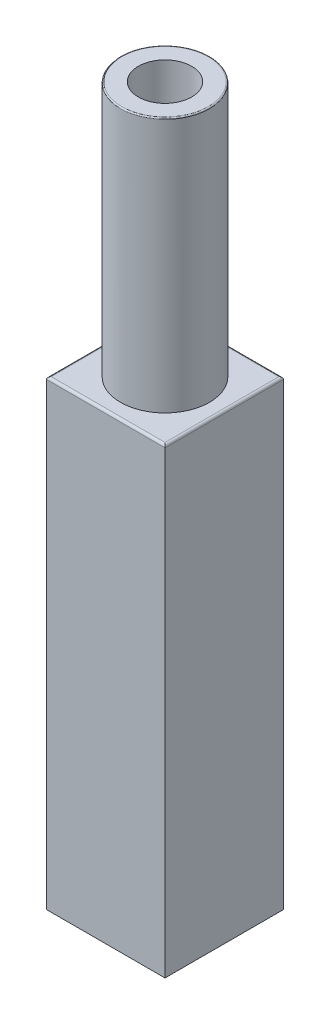
ISO-10303-21;
HEADER;
FILE_DESCRIPTION(('STEP AP214'),'2;1');
FILE_NAME('part.step','',(''),(''),'','','');
FILE_SCHEMA(('AUTOMOTIVE_DESIGN { 1 0 10303 214 1 1 1 1 }'));
ENDSEC;
DATA;
#1=APPLICATION_CONTEXT('core data for automotive mechanical design processes');
#2=APPLICATION_PROTOCOL_DEFINITION('international standard','automotive_design',2000,#1);
#3=PRODUCT_CONTEXT('',#1,'mechanical');
#4=PRODUCT('Part','Part','',(#3));
#5=PRODUCT_RELATED_PRODUCT_CATEGORY('part','',(#4));
#6=PRODUCT_DEFINITION_FORMATION('','',#4);
#7=PRODUCT_DEFINITION_CONTEXT('part definition',#1,'design');
#8=PRODUCT_DEFINITION('design','',#6,#7);
#9=PRODUCT_DEFINITION_SHAPE('','',#8);
#10=(LENGTH_UNIT() NAMED_UNIT(*) SI_UNIT(.MILLI.,.METRE.));
#11=(NAMED_UNIT(*) PLANE_ANGLE_UNIT() SI_UNIT($,.RADIAN.));
#12=(NAMED_UNIT(*) SI_UNIT($,.STERADIAN.) SOLID_ANGLE_UNIT());
#13=UNCERTAINTY_MEASURE_WITH_UNIT(LENGTH_MEASURE(1.E-05),#10,'distance_accuracy_value','');
#14=(GEOMETRIC_REPRESENTATION_CONTEXT(3) GLOBAL_UNCERTAINTY_ASSIGNED_CONTEXT((#13)) GLOBAL_UNIT_ASSIGNED_CONTEXT((#10,
#11,#12)) REPRESENTATION_CONTEXT('',''));
#15=CARTESIAN_POINT('',(0.,0.,0.));
#16=DIRECTION('',(0.,0.,1.));
#17=DIRECTION('',(1.,0.,0.));
#18=AXIS2_PLACEMENT_3D('',#15,#16,#17);
#19=CARTESIAN_POINT('',(0.,365.528532985271,0.));
#20=DIRECTION('',(0.,1.,0.));
#21=DIRECTION('',(0.,0.,1.));
#22=AXIS2_PLACEMENT_3D('',#19,#20,#21);
#23=PLANE('',#22);
#24=CARTESIAN_POINT('',(0.,365.528532985271,0.));
#25=DIRECTION('',(0.,1.,0.));
#26=DIRECTION('',(0.,0.,1.));
#27=AXIS2_PLACEMENT_3D('',#24,#25,#26);
#28=CIRCLE('',#27,36.5);
#29=CARTESIAN_POINT('',(0.,365.528532985271,36.5));
#30=VERTEX_POINT('',#29);
#31=EDGE_CURVE('E54',#30,#30,#28,.T.);
#32=ORIENTED_EDGE('',*,*,#31,.T.);
#33=EDGE_LOOP('',(#32));
#34=FACE_BOUND('',#33,.T.);
#35=CARTESIAN_POINT('',(0.,365.528532985271,0.));
#36=DIRECTION('',(0.,1.,0.));
#37=DIRECTION('',(0.,0.,1.));
#38=AXIS2_PLACEMENT_3D('',#35,#36,#37);
#39=CIRCLE('',#38,22.5);
#40=CARTESIAN_POINT('',(0.,365.528532985271,-22.5));
#41=VERTEX_POINT('',#40);
#42=EDGE_CURVE('E62',#41,#41,#39,.T.);
#43=ORIENTED_EDGE('',*,*,#42,.F.);
#44=EDGE_LOOP('',(#43));
#45=FACE_BOUND('',#44,.T.);
#46=ADVANCED_FACE('F47',(#34,#45),#23,.T.);
#47=CARTESIAN_POINT('',(0.,0.,0.));
#48=DIRECTION('',(0.,1.,0.));
#49=DIRECTION('',(0.,0.,1.));
#50=AXIS2_PLACEMENT_3D('',#47,#48,#49);
#51=PLANE('',#50);
#52=CARTESIAN_POINT('',(0.,0.,0.));
#53=DIRECTION('',(0.,1.,0.));
#54=DIRECTION('',(0.,0.,1.));
#55=AXIS2_PLACEMENT_3D('',#52,#53,#54);
#56=CIRCLE('',#55,37.5);
#57=CARTESIAN_POINT('',(0.,0.,-37.5));
#58=VERTEX_POINT('',#57);
#59=EDGE_CURVE('E58',#58,#58,#56,.T.);
#60=ORIENTED_EDGE('',*,*,#59,.F.);
#61=EDGE_LOOP('',(#60));
#62=FACE_BOUND('',#61,.T.);
#63=CARTESIAN_POINT('',(0.,0.,0.));
#64=DIRECTION('',(0.,1.,0.));
#65=DIRECTION('',(0.,0.,1.));
#66=AXIS2_PLACEMENT_3D('',#63,#64,#65);
#67=CIRCLE('',#66,22.5);
#68=CARTESIAN_POINT('',(0.,0.,-22.5));
#69=VERTEX_POINT('',#68);
#70=EDGE_CURVE('E65',#69,#69,#67,.T.);
#71=ORIENTED_EDGE('',*,*,#70,.T.);
#72=EDGE_LOOP('',(#71));
#73=FACE_BOUND('',#72,.T.);
#74=ADVANCED_FACE('F75',(#62,#73),#51,.F.);
#75=CARTESIAN_POINT('',(0.,365.528532985271,0.));
#76=DIRECTION('',(0.,-1.,0.));
#77=DIRECTION('',(0.,0.,-1.));
#78=AXIS2_PLACEMENT_3D('',#75,#76,#77);
#79=CYLINDRICAL_SURFACE('',#78,37.5);
#80=CARTESIAN_POINT('',(0.,364.528532985271,0.));
#81=DIRECTION('',(0.,1.,0.));
#82=DIRECTION('',(0.,0.,1.));
#83=AXIS2_PLACEMENT_3D('',#80,#81,#82);
#84=CIRCLE('',#83,37.5);
#85=CARTESIAN_POINT('',(0.,364.528532985271,-37.5));
#86=VERTEX_POINT('',#85);
#87=EDGE_CURVE('E12',#86,#86,#84,.F.);
#88=CARTESIAN_POINT('',(0.,364.528532985271,-37.5));
#89=CARTESIAN_POINT('',(0.,360.731360766674,-37.5));
#90=CARTESIAN_POINT('',(0.,356.934188548078,-37.5));
#91=CARTESIAN_POINT('',(0.,349.339844110885,-37.5));
#92=CARTESIAN_POINT('',(0.,345.542671892288,-37.5));
#93=CARTESIAN_POINT('',(0.,337.948327455095,-37.5));
#94=CARTESIAN_POINT('',(0.,334.151155236498,-37.5));
#95=CARTESIAN_POINT('',(0.,326.556810799305,-37.5));
#96=CARTESIAN_POINT('',(0.,322.759638580708,-37.5));
#97=CARTESIAN_POINT('',(0.,315.165294143515,-37.5));
#98=CARTESIAN_POINT('',(0.,311.368121924919,-37.5));
#99=CARTESIAN_POINT('',(0.,303.773777487726,-37.5));
#100=CARTESIAN_POINT('',(0.,299.976605269129,-37.5));
#101=CARTESIAN_POINT('',(0.,292.382260831936,-37.5));
#102=CARTESIAN_POINT('',(0.,288.585088613339,-37.5));
#103=CARTESIAN_POINT('',(0.,280.990744176146,-37.5));
#104=CARTESIAN_POINT('',(0.,277.19357195755,-37.5));
#105=CARTESIAN_POINT('',(0.,269.599227520357,-37.5));
#106=CARTESIAN_POINT('',(0.,265.80205530176,-37.5));
#107=CARTESIAN_POINT('',(0.,258.207710864567,-37.5));
#108=CARTESIAN_POINT('',(0.,254.41053864597,-37.5));
#109=CARTESIAN_POINT('',(0.,246.816194208777,-37.5));
#110=CARTESIAN_POINT('',(0.,243.019021990181,-37.5));
#111=CARTESIAN_POINT('',(0.,235.424677552987,-37.5));
#112=CARTESIAN_POINT('',(0.,231.627505334391,-37.5));
#113=CARTESIAN_POINT('',(0.,224.033160897198,-37.5));
#114=CARTESIAN_POINT('',(0.,220.235988678601,-37.5));
#115=CARTESIAN_POINT('',(0.,212.641644241408,-37.5));
#116=CARTESIAN_POINT('',(0.,208.844472022811,-37.5));
#117=CARTESIAN_POINT('',(0.,201.250127585618,-37.5));
#118=CARTESIAN_POINT('',(0.,197.452955367022,-37.5));
#119=CARTESIAN_POINT('',(0.,189.858610929829,-37.5));
#120=CARTESIAN_POINT('',(0.,186.061438711232,-37.5));
#121=CARTESIAN_POINT('',(0.,178.467094274039,-37.5));
#122=CARTESIAN_POINT('',(0.,174.669922055442,-37.5));
#123=CARTESIAN_POINT('',(0.,167.075577618249,-37.5));
#124=CARTESIAN_POINT('',(0.,163.278405399653,-37.5));
#125=CARTESIAN_POINT('',(0.,155.684060962459,-37.5));
#126=CARTESIAN_POINT('',(0.,151.886888743863,-37.5));
#127=CARTESIAN_POINT('',(0.,144.29254430667,-37.5));
#128=CARTESIAN_POINT('',(0.,140.495372088073,-37.5));
#129=CARTESIAN_POINT('',(0.,132.90102765088,-37.5));
#130=CARTESIAN_POINT('',(0.,129.103855432283,-37.5));
#131=CARTESIAN_POINT('',(0.,121.50951099509,-37.5));
#132=CARTESIAN_POINT('',(0.,117.712338776494,-37.5));
#133=CARTESIAN_POINT('',(0.,110.117994339301,-37.5));
#134=CARTESIAN_POINT('',(0.,106.320822120704,-37.5));
#135=CARTESIAN_POINT('',(0.,98.7264776835108,-37.5));
#136=CARTESIAN_POINT('',(0.,94.9293054649143,-37.5));
#137=CARTESIAN_POINT('',(0.,87.3349610277212,-37.5));
#138=CARTESIAN_POINT('',(0.,83.5377888091246,-37.5));
#139=CARTESIAN_POINT('',(0.,75.9434443719314,-37.5));
#140=CARTESIAN_POINT('',(0.,72.1462721533348,-37.5));
#141=CARTESIAN_POINT('',(0.,64.5519277161417,-37.5));
#142=CARTESIAN_POINT('',(0.,60.7547554975451,-37.5));
#143=CARTESIAN_POINT('',(0.,53.160411060352,-37.5));
#144=CARTESIAN_POINT('',(0.,49.3632388417554,-37.5));
#145=CARTESIAN_POINT('',(0.,41.7688944045623,-37.5));
#146=CARTESIAN_POINT('',(0.,37.9717221859657,-37.5));
#147=CARTESIAN_POINT('',(0.,30.3773777487725,-37.5));
#148=CARTESIAN_POINT('',(0.,26.580205530176,-37.5));
#149=CARTESIAN_POINT('',(0.,18.9858610929828,-37.5));
#150=CARTESIAN_POINT('',(0.,15.1886888743862,-37.5));
#151=CARTESIAN_POINT('',(0.,7.59434443719309,-37.5));
#152=CARTESIAN_POINT('',(0.,3.79717221859654,-37.5));
#153=CARTESIAN_POINT('',(0.,0.,-37.5));
#154=B_SPLINE_CURVE_WITH_KNOTS('',3,(#88,#89,#90,#91,#92,#93,#94,#95,#96,#97,#98,#99,#100,#101,
#102,#103,#104,#105,#106,#107,#108,#109,#110,#111,#112,#113,#114,#115,#116,#117,#118,#119,#120,
#121,#122,#123,#124,#125,#126,#127,#128,#129,#130,#131,#132,#133,#134,#135,#136,#137,#138,#139,
#140,#141,#142,#143,#144,#145,#146,#147,#148,#149,#150,#151,#152,#153),.UNSPECIFIED.,.F.,.F.,(4,
2,2,2,2,2,2,2,2,2,2,2,2,2,2,2,2,2,2,2,2,2,2,2,2,2,2,2,2,2,2,2,4),(0.,11.3915166557897,
22.7830333115794,34.1745499673692,45.5660666231589,56.9575832789486,68.3490999347383,
79.740616590528,91.1321332463177,102.523649902107,113.915166557897,125.306683213687,
136.698199869477,148.089716525266,159.481233181056,170.872749836846,182.264266492635,
193.655783148425,205.047299804215,216.438816460005,227.830333115794,239.221849771584,
250.613366427374,262.004883083163,273.396399738953,284.787916394743,296.179433050533,
307.570949706322,318.962466362112,330.353983017902,341.745499673691,353.137016329481,
364.528532985271),.UNSPECIFIED.);
#155=EDGE_CURVE('BSEAM80',#86,#58,#154,.T.);
#156=ORIENTED_EDGE('',*,*,#87,.T.);
#157=ORIENTED_EDGE('',*,*,#59,.T.);
#158=ORIENTED_EDGE('',*,*,#155,.T.);
#159=ORIENTED_EDGE('',*,*,#155,.F.);
#160=EDGE_LOOP('',(#156,#158,#157,#159));
#161=FACE_BOUND('',#160,.T.);
#162=ADVANCED_FACE('F80',(#161),#79,.T.);
#163=CARTESIAN_POINT('',(0.,365.528532985271,0.));
#164=DIRECTION('',(0.,-1.,0.));
#165=DIRECTION('',(0.,0.,-1.));
#166=AXIS2_PLACEMENT_3D('',#163,#164,#165);
#167=CYLINDRICAL_SURFACE('',#166,22.5);
#168=CARTESIAN_POINT('',(0.,365.528532985271,-22.5));
#169=CARTESIAN_POINT('',(0.,361.720944100008,-22.5));
#170=CARTESIAN_POINT('',(0.,357.913355214744,-22.5));
#171=CARTESIAN_POINT('',(0.,350.298177444218,-22.5));
#172=CARTESIAN_POINT('',(0.,346.490588558955,-22.5));
#173=CARTESIAN_POINT('',(0.,338.875410788428,-22.5));
#174=CARTESIAN_POINT('',(0.,335.067821903165,-22.5));
#175=CARTESIAN_POINT('',(0.,327.452644132638,-22.5));
#176=CARTESIAN_POINT('',(0.,323.645055247375,-22.5));
#177=CARTESIAN_POINT('',(0.,316.029877476849,-22.5));
#178=CARTESIAN_POINT('',(0.,312.222288591585,-22.5));
#179=CARTESIAN_POINT('',(0.,304.607110821059,-22.5));
#180=CARTESIAN_POINT('',(0.,300.799521935796,-22.5));
#181=CARTESIAN_POINT('',(0.,293.184344165269,-22.5));
#182=CARTESIAN_POINT('',(0.,289.376755280006,-22.5));
#183=CARTESIAN_POINT('',(0.,281.76157750948,-22.5));
#184=CARTESIAN_POINT('',(0.,277.953988624216,-22.5));
#185=CARTESIAN_POINT('',(0.,270.33881085369,-22.5));
#186=CARTESIAN_POINT('',(0.,266.531221968427,-22.5));
#187=CARTESIAN_POINT('',(0.,258.9160441979,-22.5));
#188=CARTESIAN_POINT('',(0.,255.108455312637,-22.5));
#189=CARTESIAN_POINT('',(0.,247.49327754211,-22.5));
#190=CARTESIAN_POINT('',(0.,243.685688656847,-22.5));
#191=CARTESIAN_POINT('',(0.,236.070510886321,-22.5));
#192=CARTESIAN_POINT('',(0.,232.262922001057,-22.5));
#193=CARTESIAN_POINT('',(0.,224.647744230531,-22.5));
#194=CARTESIAN_POINT('',(0.,220.840155345268,-22.5));
#195=CARTESIAN_POINT('',(0.,213.224977574741,-22.5));
#196=CARTESIAN_POINT('',(0.,209.417388689478,-22.5));
#197=CARTESIAN_POINT('',(0.,201.802210918952,-22.5));
#198=CARTESIAN_POINT('',(0.,197.994622033688,-22.5));
#199=CARTESIAN_POINT('',(0.,190.379444263162,-22.5));
#200=CARTESIAN_POINT('',(0.,186.571855377899,-22.5));
#201=CARTESIAN_POINT('',(0.,178.956677607372,-22.5));
#202=CARTESIAN_POINT('',(0.,175.149088722109,-22.5));
#203=CARTESIAN_POINT('',(0.,167.533910951582,-22.5));
#204=CARTESIAN_POINT('',(0.,163.726322066319,-22.5));
#205=CARTESIAN_POINT('',(0.,156.111144295793,-22.5));
#206=CARTESIAN_POINT('',(0.,152.303555410529,-22.5));
#207=CARTESIAN_POINT('',(0.,144.688377640003,-22.5));
#208=CARTESIAN_POINT('',(0.,140.88078875474,-22.5));
#209=CARTESIAN_POINT('',(0.,133.265610984213,-22.5));
#210=CARTESIAN_POINT('',(0.,129.45802209895,-22.5));
#211=CARTESIAN_POINT('',(0.,121.842844328424,-22.5));
#212=CARTESIAN_POINT('',(0.,118.03525544316,-22.5));
#213=CARTESIAN_POINT('',(0.,110.420077672634,-22.5));
#214=CARTESIAN_POINT('',(0.,106.612488787371,-22.5));
#215=CARTESIAN_POINT('',(0.,98.9973110168442,-22.5));
#216=CARTESIAN_POINT('',(0.,95.189722131581,-22.5));
#217=CARTESIAN_POINT('',(0.,87.5745443610545,-22.5));
#218=CARTESIAN_POINT('',(0.,83.7669554757912,-22.5));
#219=CARTESIAN_POINT('',(0.,76.1517777052647,-22.5));
#220=CARTESIAN_POINT('',(0.,72.3441888200015,-22.5));
#221=CARTESIAN_POINT('',(0.,64.729011049475,-22.5));
#222=CARTESIAN_POINT('',(0.,60.9214221642118,-22.5));
#223=CARTESIAN_POINT('',(0.,53.3062443936853,-22.5));
#224=CARTESIAN_POINT('',(0.,49.4986555084221,-22.5));
#225=CARTESIAN_POINT('',(0.,41.8834777378956,-22.5));
#226=CARTESIAN_POINT('',(0.,38.0758888526324,-22.5));
#227=CARTESIAN_POINT('',(0.,30.4607110821059,-22.5));
#228=CARTESIAN_POINT('',(0.,26.6531221968427,-22.5));
#229=CARTESIAN_POINT('',(0.,19.0379444263162,-22.5));
#230=CARTESIAN_POINT('',(0.,15.230355541053,-22.5));
#231=CARTESIAN_POINT('',(0.,7.61517777052649,-22.5));
#232=CARTESIAN_POINT('',(0.,3.80758888526324,-22.5));
#233=CARTESIAN_POINT('',(0.,0.,-22.5));
#234=B_SPLINE_CURVE_WITH_KNOTS('',3,(#168,#169,#170,#171,#172,#173,#174,#175,#176,#177,#178,
#179,#180,#181,#182,#183,#184,#185,#186,#187,#188,#189,#190,#191,#192,#193,#194,#195,#196,#197,
#198,#199,#200,#201,#202,#203,#204,#205,#206,#207,#208,#209,#210,#211,#212,#213,#214,#215,#216,
#217,#218,#219,#220,#221,#222,#223,#224,#225,#226,#227,#228,#229,#230,#231,#232,#233),
.UNSPECIFIED.,.F.,.F.,(4,2,2,2,2,2,2,2,2,2,2,2,2,2,2,2,2,2,2,2,2,2,2,2,2,2,2,2,2,2,2,2,4),(0.,
11.4227666557897,22.8455333115795,34.2682999673692,45.6910666231589,57.1138332789486,
68.5365999347383,79.959366590528,91.3821332463177,102.804899902107,114.227666557897,
125.650433213687,137.073199869477,148.495966525266,159.918733181056,171.341499836846,
182.764266492635,194.187033148425,205.609799804215,217.032566460005,228.455333115794,
239.878099771584,251.300866427374,262.723633083163,274.146399738953,285.569166394743,
296.991933050533,308.414699706322,319.837466362112,331.260233017902,342.682999673691,
354.105766329481,365.528532985271),.UNSPECIFIED.);
#235=EDGE_CURVE('BSEAM71',#41,#69,#234,.T.);
#236=ORIENTED_EDGE('',*,*,#42,.T.);
#237=ORIENTED_EDGE('',*,*,#70,.F.);
#238=ORIENTED_EDGE('',*,*,#235,.T.);
#239=ORIENTED_EDGE('',*,*,#235,.F.);
#240=EDGE_LOOP('',(#236,#238,#237,#239));
#241=FACE_BOUND('',#240,.T.);
#242=ADVANCED_FACE('F71',(#241),#167,.F.);
#243=CARTESIAN_POINT('',(0.,364.528532985271,0.));
#244=DIRECTION('',(0.,1.,0.));
#245=DIRECTION('',(0.,0.,1.));
#246=AXIS2_PLACEMENT_3D('',#243,#244,#245);
#247=TOROIDAL_SURFACE('',#246,36.5,1.);
#248=ORIENTED_EDGE('',*,*,#87,.F.);
#249=EDGE_LOOP('',(#248));
#250=FACE_BOUND('',#249,.T.);
#251=ORIENTED_EDGE('',*,*,#31,.F.);
#252=EDGE_LOOP('',(#251));
#253=FACE_BOUND('',#252,.T.);
#254=ADVANCED_FACE('F49',(#250,#253),#247,.T.);
#255=CLOSED_SHELL('',(#46,#74,#162,#242,#254));
#256=MANIFOLD_SOLID_BREP('B2',#255);
#257=CARTESIAN_POINT('',(-50.,-239.246198725206,50.));
#258=DIRECTION('',(0.,0.,1.));
#259=DIRECTION('',(1.,0.,0.));
#260=AXIS2_PLACEMENT_3D('',#257,#258,#259);
#261=PLANE('',#260);
#262=DIRECTION('',(0.,1.,0.));
#263=VECTOR('',#262,1.);
#264=CARTESIAN_POINT('',(50.,-239.246198725206,50.));
#265=LINE('',#264,#263);
#266=CARTESIAN_POINT('',(50.,-239.246198725206,50.));
#267=VERTEX_POINT('',#266);
#268=CARTESIAN_POINT('',(50.,148.,50.));
#269=VERTEX_POINT('',#268);
#270=EDGE_CURVE('E176',#267,#269,#265,.T.);
#271=ORIENTED_EDGE('',*,*,#270,.T.);
#272=DIRECTION('',(1.,0.,0.));
#273=VECTOR('',#272,1.);
#274=CARTESIAN_POINT('',(-50.,148.,50.));
#275=LINE('',#274,#273);
#276=CARTESIAN_POINT('',(-50.,148.,50.));
#277=VERTEX_POINT('',#276);
#278=EDGE_CURVE('E221',#269,#277,#275,.F.);
#279=ORIENTED_EDGE('',*,*,#278,.T.);
#280=DIRECTION('',(0.,1.,0.));
#281=VECTOR('',#280,1.);
#282=CARTESIAN_POINT('',(-50.,-239.246198725206,50.));
#283=LINE('',#282,#281);
#284=CARTESIAN_POINT('',(-50.,-239.246198725206,50.));
#285=VERTEX_POINT('',#284);
#286=EDGE_CURVE('E194',#285,#277,#283,.T.);
#287=ORIENTED_EDGE('',*,*,#286,.F.);
#288=DIRECTION('',(1.,0.,0.));
#289=VECTOR('',#288,1.);
#290=CARTESIAN_POINT('',(-50.,-239.246198725206,50.));
#291=LINE('',#290,#289);
#292=EDGE_CURVE('E189',#285,#267,#291,.T.);
#293=ORIENTED_EDGE('',*,*,#292,.T.);
#294=EDGE_LOOP('',(#271,#279,#287,#293));
#295=FACE_BOUND('',#294,.T.);
#296=ADVANCED_FACE('F124',(#295),#261,.T.);
#297=CARTESIAN_POINT('',(-50.,-239.246198725206,50.));
#298=DIRECTION('',(1.,0.,0.));
#299=DIRECTION('',(0.,0.,-1.));
#300=AXIS2_PLACEMENT_3D('',#297,#298,#299);
#301=PLANE('',#300);
#302=ORIENTED_EDGE('',*,*,#286,.T.);
#303=DIRECTION('',(0.,0.,-1.));
#304=VECTOR('',#303,1.);
#305=CARTESIAN_POINT('',(-50.,148.,-50.));
#306=LINE('',#305,#304);
#307=CARTESIAN_POINT('',(-50.,148.,-50.));
#308=VERTEX_POINT('',#307);
#309=EDGE_CURVE('E206',#277,#308,#306,.T.);
#310=ORIENTED_EDGE('',*,*,#309,.T.);
#311=DIRECTION('',(0.,1.,0.));
#312=VECTOR('',#311,1.);
#313=CARTESIAN_POINT('',(-50.,-239.246198725206,-50.));
#314=LINE('',#313,#312);
#315=CARTESIAN_POINT('',(-50.,-239.246198725206,-50.));
#316=VERTEX_POINT('',#315);
#317=EDGE_CURVE('E207',#316,#308,#314,.T.);
#318=ORIENTED_EDGE('',*,*,#317,.F.);
#319=DIRECTION('',(0.,0.,-1.));
#320=VECTOR('',#319,1.);
#321=CARTESIAN_POINT('',(-50.,-239.246198725206,50.));
#322=LINE('',#321,#320);
#323=EDGE_CURVE('E184',#285,#316,#322,.T.);
#324=ORIENTED_EDGE('',*,*,#323,.F.);
#325=EDGE_LOOP('',(#302,#310,#318,#324));
#326=FACE_BOUND('',#325,.T.);
#327=ADVANCED_FACE('F255',(#326),#301,.F.);
#328=CARTESIAN_POINT('',(-50.,-239.246198725206,-50.));
#329=DIRECTION('',(0.,0.,1.));
#330=DIRECTION('',(1.,0.,0.));
#331=AXIS2_PLACEMENT_3D('',#328,#329,#330);
#332=PLANE('',#331);
#333=ORIENTED_EDGE('',*,*,#317,.T.);
#334=DIRECTION('',(1.,0.,0.));
#335=VECTOR('',#334,1.);
#336=CARTESIAN_POINT('',(50.,148.,-50.));
#337=LINE('',#336,#335);
#338=CARTESIAN_POINT('',(50.,148.,-50.));
#339=VERTEX_POINT('',#338);
#340=EDGE_CURVE('E45',#308,#339,#337,.T.);
#341=ORIENTED_EDGE('',*,*,#340,.T.);
#342=DIRECTION('',(0.,1.,0.));
#343=VECTOR('',#342,1.);
#344=CARTESIAN_POINT('',(50.,-239.246198725206,-50.));
#345=LINE('',#344,#343);
#346=CARTESIAN_POINT('',(50.,-239.246198725206,-50.));
#347=VERTEX_POINT('',#346);
#348=EDGE_CURVE('E183',#347,#339,#345,.T.);
#349=ORIENTED_EDGE('',*,*,#348,.F.);
#350=DIRECTION('',(1.,0.,0.));
#351=VECTOR('',#350,1.);
#352=CARTESIAN_POINT('',(-50.,-239.246198725206,-50.));
#353=LINE('',#352,#351);
#354=EDGE_CURVE('E191',#316,#347,#353,.T.);
#355=ORIENTED_EDGE('',*,*,#354,.F.);
#356=EDGE_LOOP('',(#333,#341,#349,#355));
#357=FACE_BOUND('',#356,.T.);
#358=ADVANCED_FACE('F260',(#357),#332,.F.);
#359=CARTESIAN_POINT('',(50.,-239.246198725206,50.));
#360=DIRECTION('',(1.,0.,0.));
#361=DIRECTION('',(0.,0.,-1.));
#362=AXIS2_PLACEMENT_3D('',#359,#360,#361);
#363=PLANE('',#362);
#364=ORIENTED_EDGE('',*,*,#348,.T.);
#365=DIRECTION('',(0.,0.,-1.));
#366=VECTOR('',#365,1.);
#367=CARTESIAN_POINT('',(50.,148.,50.));
#368=LINE('',#367,#366);
#369=EDGE_CURVE('E133',#339,#269,#368,.F.);
#370=ORIENTED_EDGE('',*,*,#369,.T.);
#371=ORIENTED_EDGE('',*,*,#270,.F.);
#372=DIRECTION('',(0.,0.,-1.));
#373=VECTOR('',#372,1.);
#374=CARTESIAN_POINT('',(50.,-239.246198725206,50.));
#375=LINE('',#374,#373);
#376=EDGE_CURVE('E179',#267,#347,#375,.T.);
#377=ORIENTED_EDGE('',*,*,#376,.T.);
#378=EDGE_LOOP('',(#364,#370,#371,#377));
#379=FACE_BOUND('',#378,.T.);
#380=ADVANCED_FACE('F178',(#379),#363,.T.);
#381=CARTESIAN_POINT('',(0.,-239.246198725206,0.));
#382=DIRECTION('',(0.,1.,0.));
#383=DIRECTION('',(0.,0.,1.));
#384=AXIS2_PLACEMENT_3D('',#381,#382,#383);
#385=PLANE('',#384);
#386=ORIENTED_EDGE('',*,*,#292,.F.);
#387=ORIENTED_EDGE('',*,*,#323,.T.);
#388=ORIENTED_EDGE('',*,*,#354,.T.);
#389=ORIENTED_EDGE('',*,*,#376,.F.);
#390=EDGE_LOOP('',(#386,#387,#388,#389));
#391=FACE_BOUND('',#390,.T.);
#392=ADVANCED_FACE('F188',(#391),#385,.F.);
#393=CARTESIAN_POINT('',(0.,150.,0.));
#394=DIRECTION('',(0.,1.,0.));
#395=DIRECTION('',(0.,0.,1.));
#396=AXIS2_PLACEMENT_3D('',#393,#394,#395);
#397=PLANE('',#396);
#398=DIRECTION('',(1.,0.,0.));
#399=VECTOR('',#398,1.);
#400=CARTESIAN_POINT('',(-50.,150.,-48.));
#401=LINE('',#400,#399);
#402=CARTESIAN_POINT('',(48.,150.,-48.));
#403=VERTEX_POINT('',#402);
#404=CARTESIAN_POINT('',(-48.,150.,-48.));
#405=VERTEX_POINT('',#404);
#406=EDGE_CURVE('E212',#403,#405,#401,.F.);
#407=ORIENTED_EDGE('',*,*,#406,.T.);
#408=DIRECTION('',(0.,0.,-1.));
#409=VECTOR('',#408,1.);
#410=CARTESIAN_POINT('',(-48.,150.,50.));
#411=LINE('',#410,#409);
#412=CARTESIAN_POINT('',(-48.,150.,48.));
#413=VERTEX_POINT('',#412);
#414=EDGE_CURVE('E218',#405,#413,#411,.F.);
#415=ORIENTED_EDGE('',*,*,#414,.T.);
#416=DIRECTION('',(1.,0.,0.));
#417=VECTOR('',#416,1.);
#418=CARTESIAN_POINT('',(0.,150.,48.));
#419=LINE('',#418,#417);
#420=CARTESIAN_POINT('',(48.,150.,48.));
#421=VERTEX_POINT('',#420);
#422=EDGE_CURVE('E216',#413,#421,#419,.T.);
#423=ORIENTED_EDGE('',*,*,#422,.T.);
#424=DIRECTION('',(0.,0.,-1.));
#425=VECTOR('',#424,1.);
#426=CARTESIAN_POINT('',(48.,150.,0.));
#427=LINE('',#426,#425);
#428=EDGE_CURVE('E214',#421,#403,#427,.T.);
#429=ORIENTED_EDGE('',*,*,#428,.T.);
#430=EDGE_LOOP('',(#407,#415,#423,#429));
#431=FACE_BOUND('',#430,.T.);
#432=CARTESIAN_POINT('',(0.,150.,0.));
#433=DIRECTION('',(0.,1.,0.));
#434=DIRECTION('',(0.,0.,1.));
#435=AXIS2_PLACEMENT_3D('',#432,#433,#434);
#436=CIRCLE('',#435,22.5);
#437=CARTESIAN_POINT('',(0.,150.,22.5));
#438=VERTEX_POINT('',#437);
#439=EDGE_CURVE('E196',#438,#438,#436,.F.);
#440=ORIENTED_EDGE('',*,*,#439,.T.);
#441=EDGE_LOOP('',(#440));
#442=FACE_BOUND('',#441,.T.);
#443=ADVANCED_FACE('F243',(#431,#442),#397,.T.);
#444=CARTESIAN_POINT('',(0.,215.,0.));
#445=DIRECTION('',(0.,-1.,0.));
#446=DIRECTION('',(0.,0.,-1.));
#447=AXIS2_PLACEMENT_3D('',#444,#445,#446);
#448=CYLINDRICAL_SURFACE('',#447,22.5);
#449=ORIENTED_EDGE('',*,*,#439,.F.);
#450=EDGE_LOOP('',(#449));
#451=FACE_BOUND('',#450,.T.);
#452=CARTESIAN_POINT('',(0.,0.,0.));
#453=DIRECTION('',(0.,1.,0.));
#454=DIRECTION('',(0.,0.,1.));
#455=AXIS2_PLACEMENT_3D('',#452,#453,#454);
#456=CIRCLE('',#455,22.5);
#457=CARTESIAN_POINT('',(0.,0.,22.5));
#458=VERTEX_POINT('',#457);
#459=EDGE_CURVE('E199',#458,#458,#456,.T.);
#460=ORIENTED_EDGE('',*,*,#459,.F.);
#461=EDGE_LOOP('',(#460));
#462=FACE_BOUND('',#461,.T.);
#463=ADVANCED_FACE('F241',(#451,#462),#448,.F.);
#464=CARTESIAN_POINT('',(0.,0.,0.));
#465=DIRECTION('',(0.,1.,0.));
#466=DIRECTION('',(0.,0.,1.));
#467=AXIS2_PLACEMENT_3D('',#464,#465,#466);
#468=PLANE('',#467);
#469=ORIENTED_EDGE('',*,*,#459,.T.);
#470=EDGE_LOOP('',(#469));
#471=FACE_BOUND('',#470,.T.);
#472=ADVANCED_FACE('F239',(#471),#468,.T.);
#473=CARTESIAN_POINT('',(48.,148.,0.));
#474=DIRECTION('',(0.,0.,-1.));
#475=DIRECTION('',(-1.,0.,0.));
#476=AXIS2_PLACEMENT_3D('',#473,#474,#475);
#477=CYLINDRICAL_SURFACE('',#476,2.);
#478=CARTESIAN_POINT('',(48.,148.,-48.));
#479=DIRECTION('',(-0.707106781186547,0.,-0.707106781186547));
#480=DIRECTION('',(-0.707106781186547,0.,0.707106781186547));
#481=AXIS2_PLACEMENT_3D('',#478,#479,#480);
#482=ELLIPSE('',#481,2.82842712474619,2.);
#483=EDGE_CURVE('E227',#403,#339,#482,.T.);
#484=ORIENTED_EDGE('',*,*,#483,.F.);
#485=ORIENTED_EDGE('',*,*,#428,.F.);
#486=CARTESIAN_POINT('',(48.,148.,48.));
#487=DIRECTION('',(0.707106781186547,0.,-0.707106781186547));
#488=DIRECTION('',(-0.707106781186547,0.,-0.707106781186547));
#489=AXIS2_PLACEMENT_3D('',#486,#487,#488);
#490=ELLIPSE('',#489,2.82842712474619,2.);
#491=EDGE_CURVE('E128',#269,#421,#490,.F.);
#492=ORIENTED_EDGE('',*,*,#491,.F.);
#493=ORIENTED_EDGE('',*,*,#369,.F.);
#494=EDGE_LOOP('',(#484,#485,#492,#493));
#495=FACE_BOUND('',#494,.T.);
#496=ADVANCED_FACE('F126',(#495),#477,.T.);
#497=CARTESIAN_POINT('',(0.,148.,48.));
#498=DIRECTION('',(1.,0.,0.));
#499=DIRECTION('',(0.,0.,-1.));
#500=AXIS2_PLACEMENT_3D('',#497,#498,#499);
#501=CYLINDRICAL_SURFACE('',#500,2.);
#502=ORIENTED_EDGE('',*,*,#491,.T.);
#503=ORIENTED_EDGE('',*,*,#422,.F.);
#504=CARTESIAN_POINT('',(-48.,148.,48.));
#505=DIRECTION('',(0.707106781186547,0.,0.707106781186547));
#506=DIRECTION('',(0.707106781186547,0.,-0.707106781186547));
#507=AXIS2_PLACEMENT_3D('',#504,#505,#506);
#508=ELLIPSE('',#507,2.82842712474619,2.);
#509=EDGE_CURVE('E226',#277,#413,#508,.F.);
#510=ORIENTED_EDGE('',*,*,#509,.F.);
#511=ORIENTED_EDGE('',*,*,#278,.F.);
#512=EDGE_LOOP('',(#502,#503,#510,#511));
#513=FACE_BOUND('',#512,.T.);
#514=ADVANCED_FACE('F272',(#513),#501,.T.);
#515=CARTESIAN_POINT('',(-50.,148.,-48.));
#516=DIRECTION('',(-1.,0.,0.));
#517=DIRECTION('',(0.,0.,1.));
#518=AXIS2_PLACEMENT_3D('',#515,#516,#517);
#519=CYLINDRICAL_SURFACE('',#518,2.);
#520=ORIENTED_EDGE('',*,*,#483,.T.);
#521=ORIENTED_EDGE('',*,*,#340,.F.);
#522=CARTESIAN_POINT('',(-48.,148.,-48.));
#523=DIRECTION('',(-0.707106781186547,0.,0.707106781186547));
#524=DIRECTION('',(-0.707106781186547,0.,-0.707106781186547));
#525=AXIS2_PLACEMENT_3D('',#522,#523,#524);
#526=ELLIPSE('',#525,2.82842712474619,2.);
#527=EDGE_CURVE('E224',#405,#308,#526,.T.);
#528=ORIENTED_EDGE('',*,*,#527,.F.);
#529=ORIENTED_EDGE('',*,*,#406,.F.);
#530=EDGE_LOOP('',(#520,#521,#528,#529));
#531=FACE_BOUND('',#530,.T.);
#532=ADVANCED_FACE('F269',(#531),#519,.T.);
#533=CARTESIAN_POINT('',(-48.,148.,50.));
#534=DIRECTION('',(0.,0.,1.));
#535=DIRECTION('',(1.,0.,0.));
#536=AXIS2_PLACEMENT_3D('',#533,#534,#535);
#537=CYLINDRICAL_SURFACE('',#536,2.);
#538=ORIENTED_EDGE('',*,*,#509,.T.);
#539=ORIENTED_EDGE('',*,*,#414,.F.);
#540=ORIENTED_EDGE('',*,*,#527,.T.);
#541=ORIENTED_EDGE('',*,*,#309,.F.);
#542=EDGE_LOOP('',(#538,#539,#540,#541));
#543=FACE_BOUND('',#542,.T.);
#544=ADVANCED_FACE('F266',(#543),#537,.T.);
#545=CLOSED_SHELL('',(#296,#327,#358,#380,#392,#443,#463,#472,#496,#514,#532,#544));
#546=MANIFOLD_SOLID_BREP('B7',#545);
#547=ADVANCED_BREP_SHAPE_REPRESENTATION('',(#18,#256,#546),#14);
#548=SHAPE_DEFINITION_REPRESENTATION(#9,#547);
ENDSEC;
END-ISO-10303-21;
